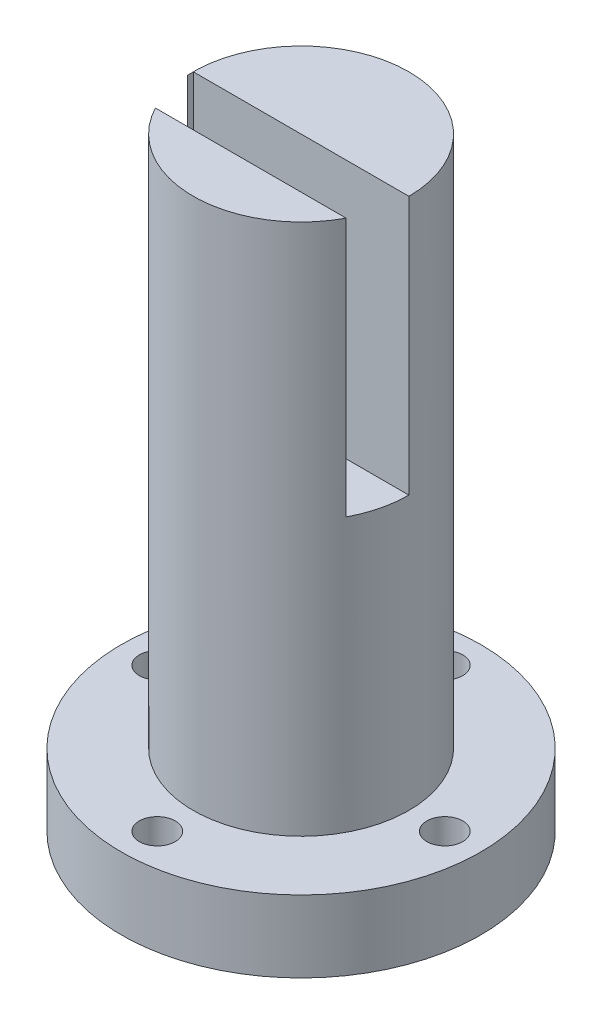
ISO-10303-21;
HEADER;
FILE_DESCRIPTION(('STEP AP214'),'2;1');
FILE_NAME('part.step','',(''),(''),'','','');
FILE_SCHEMA(('AUTOMOTIVE_DESIGN { 1 0 10303 214 1 1 1 1 }'));
ENDSEC;
DATA;
#1=APPLICATION_CONTEXT('core data for automotive mechanical design processes');
#2=APPLICATION_PROTOCOL_DEFINITION('international standard','automotive_design',2000,#1);
#3=PRODUCT_CONTEXT('',#1,'mechanical');
#4=PRODUCT('Part','Part','',(#3));
#5=PRODUCT_RELATED_PRODUCT_CATEGORY('part','',(#4));
#6=PRODUCT_DEFINITION_FORMATION('','',#4);
#7=PRODUCT_DEFINITION_CONTEXT('part definition',#1,'design');
#8=PRODUCT_DEFINITION('design','',#6,#7);
#9=PRODUCT_DEFINITION_SHAPE('','',#8);
#10=(LENGTH_UNIT() NAMED_UNIT(*) SI_UNIT(.MILLI.,.METRE.));
#11=(NAMED_UNIT(*) PLANE_ANGLE_UNIT() SI_UNIT($,.RADIAN.));
#12=(NAMED_UNIT(*) SI_UNIT($,.STERADIAN.) SOLID_ANGLE_UNIT());
#13=UNCERTAINTY_MEASURE_WITH_UNIT(LENGTH_MEASURE(1.E-05),#10,'distance_accuracy_value','');
#14=(GEOMETRIC_REPRESENTATION_CONTEXT(3) GLOBAL_UNCERTAINTY_ASSIGNED_CONTEXT((#13)) GLOBAL_UNIT_ASSIGNED_CONTEXT((#10,
#11,#12)) REPRESENTATION_CONTEXT('',''));
#15=CARTESIAN_POINT('',(0.,0.,0.));
#16=DIRECTION('',(0.,0.,1.));
#17=DIRECTION('',(1.,0.,0.));
#18=AXIS2_PLACEMENT_3D('',#15,#16,#17);
#19=CARTESIAN_POINT('',(0.,44.,0.));
#20=DIRECTION('',(0.,1.,0.));
#21=DIRECTION('',(0.,0.,1.));
#22=AXIS2_PLACEMENT_3D('',#19,#20,#21);
#23=PLANE('',#22);
#24=DIRECTION('',(1.,0.,0.));
#25=VECTOR('',#24,1.);
#26=CARTESIAN_POINT('',(0.,44.,7.));
#27=LINE('',#26,#25);
#28=CARTESIAN_POINT('',(-13.2664991614216,44.,7.00000000000001));
#29=VERTEX_POINT('',#28);
#30=CARTESIAN_POINT('',(13.2664991614216,44.,7.));
#31=VERTEX_POINT('',#30);
#32=EDGE_CURVE('E124',#29,#31,#27,.T.);
#33=ORIENTED_EDGE('',*,*,#32,.F.);
#34=CARTESIAN_POINT('',(0.,44.,0.));
#35=DIRECTION('',(0.,1.,0.));
#36=DIRECTION('',(0.,0.,1.));
#37=AXIS2_PLACEMENT_3D('',#34,#35,#36);
#38=CIRCLE('',#37,15.);
#39=EDGE_CURVE('E120',#29,#31,#38,.T.);
#40=ORIENTED_EDGE('',*,*,#39,.T.);
#41=EDGE_LOOP('',(#33,#40));
#42=FACE_BOUND('',#41,.T.);
#43=ADVANCED_FACE('F37',(#42),#23,.T.);
#44=CARTESIAN_POINT('',(0.,44.,0.));
#45=DIRECTION('',(0.,-1.,0.));
#46=DIRECTION('',(0.,0.,-1.));
#47=AXIS2_PLACEMENT_3D('',#44,#45,#46);
#48=CYLINDRICAL_SURFACE('',#47,15.);
#49=CARTESIAN_POINT('',(15.,44.,0.));
#50=VERTEX_POINT('',#49);
#51=CARTESIAN_POINT('',(-14.9788084874822,44.,0.797054763068494));
#52=VERTEX_POINT('',#51);
#53=EDGE_CURVE('E123',#50,#52,#38,.T.);
#54=ORIENTED_EDGE('',*,*,#53,.F.);
#55=DIRECTION('',(0.,1.,0.));
#56=VECTOR('',#55,1.);
#57=CARTESIAN_POINT('',(15.,8.,0.));
#58=LINE('',#57,#56);
#59=CARTESIAN_POINT('',(15.,8.,0.));
#60=VERTEX_POINT('',#59);
#61=EDGE_CURVE('E92',#60,#50,#58,.T.);
#62=ORIENTED_EDGE('',*,*,#61,.F.);
#63=CARTESIAN_POINT('',(0.,8.,0.));
#64=DIRECTION('',(0.,1.,0.));
#65=DIRECTION('',(0.,0.,1.));
#66=AXIS2_PLACEMENT_3D('',#63,#64,#65);
#67=CIRCLE('',#66,15.);
#68=CARTESIAN_POINT('',(13.2664991614216,8.,7.));
#69=VERTEX_POINT('',#68);
#70=EDGE_CURVE('E11',#69,#60,#67,.T.);
#71=ORIENTED_EDGE('',*,*,#70,.F.);
#72=DIRECTION('',(0.,-1.,0.));
#73=VECTOR('',#72,1.);
#74=CARTESIAN_POINT('',(13.2664991614216,44.,7.));
#75=LINE('',#74,#73);
#76=EDGE_CURVE('E62',#69,#31,#75,.F.);
#77=ORIENTED_EDGE('',*,*,#76,.T.);
#78=ORIENTED_EDGE('',*,*,#39,.F.);
#79=DIRECTION('',(0.,-1.,0.));
#80=VECTOR('',#79,1.);
#81=CARTESIAN_POINT('',(-13.2664991614216,44.,7.00000000000001));
#82=LINE('',#81,#80);
#83=CARTESIAN_POINT('',(-13.2664991614216,8.,7.00000000000001));
#84=VERTEX_POINT('',#83);
#85=EDGE_CURVE('E117',#29,#84,#82,.T.);
#86=ORIENTED_EDGE('',*,*,#85,.T.);
#87=CARTESIAN_POINT('',(-14.9788084874822,8.,0.797054763068494));
#88=VERTEX_POINT('',#87);
#89=EDGE_CURVE('E46',#88,#84,#67,.T.);
#90=ORIENTED_EDGE('',*,*,#89,.F.);
#91=DIRECTION('',(0.,-1.,0.));
#92=VECTOR('',#91,1.);
#93=CARTESIAN_POINT('',(-14.9788084874822,44.,0.797054763068494));
#94=LINE('',#93,#92);
#95=EDGE_CURVE('E99',#88,#52,#94,.F.);
#96=ORIENTED_EDGE('',*,*,#95,.T.);
#97=EDGE_LOOP('',(#54,#62,#71,#77,#78,#86,#90,#96));
#98=FACE_BOUND('',#97,.T.);
#99=CARTESIAN_POINT('',(0.,-30.,0.));
#100=DIRECTION('',(0.,-1.,0.));
#101=DIRECTION('',(0.,0.,-1.));
#102=AXIS2_PLACEMENT_3D('',#99,#100,#101);
#103=CIRCLE('',#102,15.);
#104=CARTESIAN_POINT('',(0.,-30.,-15.));
#105=VERTEX_POINT('',#104);
#106=EDGE_CURVE('E109',#105,#105,#103,.T.);
#107=ORIENTED_EDGE('',*,*,#106,.F.);
#108=EDGE_LOOP('',(#107));
#109=FACE_BOUND('',#108,.T.);
#110=ADVANCED_FACE('F39',(#98,#109),#48,.T.);
#111=DIRECTION('',(-1.,0.,0.));
#112=VECTOR('',#111,1.);
#113=CARTESIAN_POINT('',(15.,44.,0.));
#114=LINE('',#113,#112);
#115=CARTESIAN_POINT('',(-14.9788084874822,44.,0.));
#116=VERTEX_POINT('',#115);
#117=EDGE_CURVE('E54',#50,#116,#114,.T.);
#118=ORIENTED_EDGE('',*,*,#117,.F.);
#119=ORIENTED_EDGE('',*,*,#53,.T.);
#120=DIRECTION('',(0.,0.,1.));
#121=VECTOR('',#120,1.);
#122=CARTESIAN_POINT('',(-14.9788084874822,44.,0.));
#123=LINE('',#122,#121);
#124=EDGE_CURVE('E105',#116,#52,#123,.T.);
#125=ORIENTED_EDGE('',*,*,#124,.F.);
#126=EDGE_LOOP('',(#118,#119,#125));
#127=FACE_BOUND('',#126,.T.);
#128=ADVANCED_FACE('F186',(#127),#23,.T.);
#129=CARTESIAN_POINT('',(0.,8.,0.));
#130=DIRECTION('',(0.,1.,0.));
#131=DIRECTION('',(0.,0.,1.));
#132=AXIS2_PLACEMENT_3D('',#129,#130,#131);
#133=PLANE('',#132);
#134=ORIENTED_EDGE('',*,*,#70,.T.);
#135=DIRECTION('',(-1.,0.,0.));
#136=VECTOR('',#135,1.);
#137=CARTESIAN_POINT('',(15.,8.,0.));
#138=LINE('',#137,#136);
#139=CARTESIAN_POINT('',(-14.9788084874822,8.,0.));
#140=VERTEX_POINT('',#139);
#141=EDGE_CURVE('E88',#60,#140,#138,.T.);
#142=ORIENTED_EDGE('',*,*,#141,.T.);
#143=DIRECTION('',(0.,0.,1.));
#144=VECTOR('',#143,1.);
#145=CARTESIAN_POINT('',(-14.9788084874822,8.,0.));
#146=LINE('',#145,#144);
#147=EDGE_CURVE('E96',#140,#88,#146,.T.);
#148=ORIENTED_EDGE('',*,*,#147,.T.);
#149=ORIENTED_EDGE('',*,*,#89,.T.);
#150=DIRECTION('',(1.,0.,0.));
#151=VECTOR('',#150,1.);
#152=CARTESIAN_POINT('',(15.,8.,7.));
#153=LINE('',#152,#151);
#154=EDGE_CURVE('E93',#84,#69,#153,.T.);
#155=ORIENTED_EDGE('',*,*,#154,.T.);
#156=EDGE_LOOP('',(#134,#142,#148,#149,#155));
#157=FACE_BOUND('',#156,.T.);
#158=ADVANCED_FACE('F103',(#157),#133,.T.);
#159=CARTESIAN_POINT('',(15.,8.,7.));
#160=DIRECTION('',(0.,0.,1.));
#161=DIRECTION('',(1.,0.,0.));
#162=AXIS2_PLACEMENT_3D('',#159,#160,#161);
#163=PLANE('',#162);
#164=ORIENTED_EDGE('',*,*,#32,.T.);
#165=ORIENTED_EDGE('',*,*,#76,.F.);
#166=ORIENTED_EDGE('',*,*,#154,.F.);
#167=ORIENTED_EDGE('',*,*,#85,.F.);
#168=EDGE_LOOP('',(#164,#165,#166,#167));
#169=FACE_BOUND('',#168,.T.);
#170=ADVANCED_FACE('F197',(#169),#163,.F.);
#171=CARTESIAN_POINT('',(-14.9788084874822,8.,0.));
#172=DIRECTION('',(-1.,0.,0.));
#173=DIRECTION('',(0.,0.,1.));
#174=AXIS2_PLACEMENT_3D('',#171,#172,#173);
#175=PLANE('',#174);
#176=ORIENTED_EDGE('',*,*,#147,.F.);
#177=DIRECTION('',(0.,1.,0.));
#178=VECTOR('',#177,1.);
#179=CARTESIAN_POINT('',(-14.9788084874822,8.,0.));
#180=LINE('',#179,#178);
#181=EDGE_CURVE('E84',#140,#116,#180,.T.);
#182=ORIENTED_EDGE('',*,*,#181,.T.);
#183=ORIENTED_EDGE('',*,*,#124,.T.);
#184=ORIENTED_EDGE('',*,*,#95,.F.);
#185=EDGE_LOOP('',(#176,#182,#183,#184));
#186=FACE_BOUND('',#185,.T.);
#187=ADVANCED_FACE('F97',(#186),#175,.F.);
#188=CARTESIAN_POINT('',(15.,8.,0.));
#189=DIRECTION('',(0.,0.,-1.));
#190=DIRECTION('',(-1.,0.,0.));
#191=AXIS2_PLACEMENT_3D('',#188,#189,#190);
#192=PLANE('',#191);
#193=ORIENTED_EDGE('',*,*,#117,.T.);
#194=ORIENTED_EDGE('',*,*,#181,.F.);
#195=ORIENTED_EDGE('',*,*,#141,.F.);
#196=ORIENTED_EDGE('',*,*,#61,.T.);
#197=EDGE_LOOP('',(#193,#194,#195,#196));
#198=FACE_BOUND('',#197,.T.);
#199=ADVANCED_FACE('F86',(#198),#192,.F.);
#200=CARTESIAN_POINT('',(0.,-40.,0.));
#201=DIRECTION('',(0.,1.,0.));
#202=DIRECTION('',(0.,0.,1.));
#203=AXIS2_PLACEMENT_3D('',#200,#201,#202);
#204=CYLINDRICAL_SURFACE('',#203,25.);
#205=CARTESIAN_POINT('',(0.,-40.,0.));
#206=DIRECTION('',(0.,-1.,0.));
#207=DIRECTION('',(0.,0.,-1.));
#208=AXIS2_PLACEMENT_3D('',#205,#206,#207);
#209=CIRCLE('',#208,25.);
#210=CARTESIAN_POINT('',(0.,-40.,-25.));
#211=VERTEX_POINT('',#210);
#212=EDGE_CURVE('E141',#211,#211,#209,.T.);
#213=ORIENTED_EDGE('',*,*,#212,.F.);
#214=EDGE_LOOP('',(#213));
#215=FACE_BOUND('',#214,.T.);
#216=CARTESIAN_POINT('',(0.,-30.,0.));
#217=DIRECTION('',(0.,-1.,0.));
#218=DIRECTION('',(0.,0.,-1.));
#219=AXIS2_PLACEMENT_3D('',#216,#217,#218);
#220=CIRCLE('',#219,25.);
#221=CARTESIAN_POINT('',(0.,-30.,-25.));
#222=VERTEX_POINT('',#221);
#223=EDGE_CURVE('E137',#222,#222,#220,.T.);
#224=ORIENTED_EDGE('',*,*,#223,.T.);
#225=EDGE_LOOP('',(#224));
#226=FACE_BOUND('',#225,.T.);
#227=ADVANCED_FACE('F166',(#215,#226),#204,.T.);
#228=CARTESIAN_POINT('',(0.,-40.,0.));
#229=DIRECTION('',(0.,-1.,0.));
#230=DIRECTION('',(0.,0.,-1.));
#231=AXIS2_PLACEMENT_3D('',#228,#229,#230);
#232=PLANE('',#231);
#233=CARTESIAN_POINT('',(0.,-40.,20.));
#234=DIRECTION('',(0.,-1.,0.));
#235=DIRECTION('',(0.,0.,-1.));
#236=AXIS2_PLACEMENT_3D('',#233,#234,#235);
#237=CIRCLE('',#236,2.5);
#238=CARTESIAN_POINT('',(0.,-40.,17.5));
#239=VERTEX_POINT('',#238);
#240=EDGE_CURVE('E130',#239,#239,#237,.T.);
#241=ORIENTED_EDGE('',*,*,#240,.F.);
#242=EDGE_LOOP('',(#241));
#243=FACE_BOUND('',#242,.T.);
#244=CARTESIAN_POINT('',(20.0000000000006,-40.,5.64760248210638E-13));
#245=DIRECTION('',(0.,-1.,0.));
#246=DIRECTION('',(0.,0.,-1.));
#247=AXIS2_PLACEMENT_3D('',#244,#245,#246);
#248=CIRCLE('',#247,2.50000000000044);
#249=CARTESIAN_POINT('',(20.0000000000006,-40.,-2.49999999999988));
#250=VERTEX_POINT('',#249);
#251=EDGE_CURVE('E153',#250,#250,#248,.T.);
#252=ORIENTED_EDGE('',*,*,#251,.F.);
#253=EDGE_LOOP('',(#252));
#254=FACE_BOUND('',#253,.T.);
#255=CARTESIAN_POINT('',(1.12952049642128E-12,-40.,-20.));
#256=DIRECTION('',(0.,-1.,0.));
#257=DIRECTION('',(0.,0.,-1.));
#258=AXIS2_PLACEMENT_3D('',#255,#256,#257);
#259=CIRCLE('',#258,2.50000000000121);
#260=CARTESIAN_POINT('',(1.12952049642128E-12,-40.,-22.5000000000012));
#261=VERTEX_POINT('',#260);
#262=EDGE_CURVE('E150',#261,#261,#259,.T.);
#263=ORIENTED_EDGE('',*,*,#262,.F.);
#264=EDGE_LOOP('',(#263));
#265=FACE_BOUND('',#264,.T.);
#266=CARTESIAN_POINT('',(-19.9999999999994,-40.,-5.67209541808933E-13));
#267=DIRECTION('',(0.,-1.,0.));
#268=DIRECTION('',(0.,0.,-1.));
#269=AXIS2_PLACEMENT_3D('',#266,#267,#268);
#270=CIRCLE('',#269,2.50000000000091);
#271=CARTESIAN_POINT('',(-19.9999999999994,-40.,-2.50000000000147));
#272=VERTEX_POINT('',#271);
#273=EDGE_CURVE('E147',#272,#272,#270,.T.);
#274=ORIENTED_EDGE('',*,*,#273,.F.);
#275=EDGE_LOOP('',(#274));
#276=FACE_BOUND('',#275,.T.);
#277=ORIENTED_EDGE('',*,*,#212,.T.);
#278=EDGE_LOOP('',(#277));
#279=FACE_BOUND('',#278,.T.);
#280=ADVANCED_FACE('F162',(#243,#254,#265,#276,#279),#232,.T.);
#281=CARTESIAN_POINT('',(0.,-30.,0.));
#282=DIRECTION('',(0.,-1.,0.));
#283=DIRECTION('',(0.,0.,-1.));
#284=AXIS2_PLACEMENT_3D('',#281,#282,#283);
#285=PLANE('',#284);
#286=CARTESIAN_POINT('',(0.,-30.,20.));
#287=DIRECTION('',(0.,-1.,0.));
#288=DIRECTION('',(0.,0.,-1.));
#289=AXIS2_PLACEMENT_3D('',#286,#287,#288);
#290=CIRCLE('',#289,2.5);
#291=CARTESIAN_POINT('',(0.,-30.,17.5));
#292=VERTEX_POINT('',#291);
#293=EDGE_CURVE('E41',#292,#292,#290,.T.);
#294=ORIENTED_EDGE('',*,*,#293,.T.);
#295=EDGE_LOOP('',(#294));
#296=FACE_BOUND('',#295,.T.);
#297=CARTESIAN_POINT('',(20.0000000000006,-30.,5.64760248210638E-13));
#298=DIRECTION('',(0.,-1.,0.));
#299=DIRECTION('',(0.,0.,-1.));
#300=AXIS2_PLACEMENT_3D('',#297,#298,#299);
#301=CIRCLE('',#300,2.50000000000044);
#302=CARTESIAN_POINT('',(20.0000000000006,-30.,-2.49999999999988));
#303=VERTEX_POINT('',#302);
#304=EDGE_CURVE('E132',#303,#303,#301,.T.);
#305=ORIENTED_EDGE('',*,*,#304,.T.);
#306=EDGE_LOOP('',(#305));
#307=FACE_BOUND('',#306,.T.);
#308=CARTESIAN_POINT('',(1.12952049642128E-12,-30.,-20.));
#309=DIRECTION('',(0.,-1.,0.));
#310=DIRECTION('',(0.,0.,-1.));
#311=AXIS2_PLACEMENT_3D('',#308,#309,#310);
#312=CIRCLE('',#311,2.50000000000121);
#313=CARTESIAN_POINT('',(1.12952049642128E-12,-30.,-22.5000000000012));
#314=VERTEX_POINT('',#313);
#315=EDGE_CURVE('E129',#314,#314,#312,.T.);
#316=ORIENTED_EDGE('',*,*,#315,.T.);
#317=EDGE_LOOP('',(#316));
#318=FACE_BOUND('',#317,.T.);
#319=CARTESIAN_POINT('',(-19.9999999999994,-30.,-5.67209541808933E-13));
#320=DIRECTION('',(0.,-1.,0.));
#321=DIRECTION('',(0.,0.,-1.));
#322=AXIS2_PLACEMENT_3D('',#319,#320,#321);
#323=CIRCLE('',#322,2.50000000000091);
#324=CARTESIAN_POINT('',(-19.9999999999994,-30.,-2.50000000000147));
#325=VERTEX_POINT('',#324);
#326=EDGE_CURVE('E126',#325,#325,#323,.T.);
#327=ORIENTED_EDGE('',*,*,#326,.T.);
#328=EDGE_LOOP('',(#327));
#329=FACE_BOUND('',#328,.T.);
#330=ORIENTED_EDGE('',*,*,#106,.T.);
#331=EDGE_LOOP('',(#330));
#332=FACE_BOUND('',#331,.T.);
#333=ORIENTED_EDGE('',*,*,#223,.F.);
#334=EDGE_LOOP('',(#333));
#335=FACE_BOUND('',#334,.T.);
#336=ADVANCED_FACE('F165',(#296,#307,#318,#329,#332,#335),#285,.F.);
#337=CARTESIAN_POINT('',(-19.9999999999994,44.,-5.67209541808933E-13));
#338=DIRECTION('',(0.,-1.,0.));
#339=DIRECTION('',(0.,0.,-1.));
#340=AXIS2_PLACEMENT_3D('',#337,#338,#339);
#341=CYLINDRICAL_SURFACE('',#340,2.50000000000091);
#342=ORIENTED_EDGE('',*,*,#273,.T.);
#343=EDGE_LOOP('',(#342));
#344=FACE_BOUND('',#343,.T.);
#345=ORIENTED_EDGE('',*,*,#326,.F.);
#346=EDGE_LOOP('',(#345));
#347=FACE_BOUND('',#346,.T.);
#348=ADVANCED_FACE('F243',(#344,#347),#341,.F.);
#349=CARTESIAN_POINT('',(1.12952049642128E-12,44.,-20.));
#350=DIRECTION('',(0.,-1.,0.));
#351=DIRECTION('',(0.,0.,-1.));
#352=AXIS2_PLACEMENT_3D('',#349,#350,#351);
#353=CYLINDRICAL_SURFACE('',#352,2.50000000000121);
#354=ORIENTED_EDGE('',*,*,#262,.T.);
#355=EDGE_LOOP('',(#354));
#356=FACE_BOUND('',#355,.T.);
#357=ORIENTED_EDGE('',*,*,#315,.F.);
#358=EDGE_LOOP('',(#357));
#359=FACE_BOUND('',#358,.T.);
#360=ADVANCED_FACE('F252',(#356,#359),#353,.F.);
#361=CARTESIAN_POINT('',(20.0000000000006,44.,5.64760248210638E-13));
#362=DIRECTION('',(0.,-1.,0.));
#363=DIRECTION('',(0.,0.,-1.));
#364=AXIS2_PLACEMENT_3D('',#361,#362,#363);
#365=CYLINDRICAL_SURFACE('',#364,2.50000000000044);
#366=ORIENTED_EDGE('',*,*,#251,.T.);
#367=EDGE_LOOP('',(#366));
#368=FACE_BOUND('',#367,.T.);
#369=ORIENTED_EDGE('',*,*,#304,.F.);
#370=EDGE_LOOP('',(#369));
#371=FACE_BOUND('',#370,.T.);
#372=ADVANCED_FACE('F263',(#368,#371),#365,.F.);
#373=CARTESIAN_POINT('',(0.,44.,20.));
#374=DIRECTION('',(0.,-1.,0.));
#375=DIRECTION('',(0.,0.,-1.));
#376=AXIS2_PLACEMENT_3D('',#373,#374,#375);
#377=CYLINDRICAL_SURFACE('',#376,2.5);
#378=ORIENTED_EDGE('',*,*,#240,.T.);
#379=EDGE_LOOP('',(#378));
#380=FACE_BOUND('',#379,.T.);
#381=ORIENTED_EDGE('',*,*,#293,.F.);
#382=EDGE_LOOP('',(#381));
#383=FACE_BOUND('',#382,.T.);
#384=ADVANCED_FACE('F159',(#380,#383),#377,.F.);
#385=CLOSED_SHELL('',(#43,#110,#128,#158,#170,#187,#199,#227,#280,#336,#348,#360,#372,#384));
#386=MANIFOLD_SOLID_BREP('B2',#385);
#387=ADVANCED_BREP_SHAPE_REPRESENTATION('',(#18,#386),#14);
#388=SHAPE_DEFINITION_REPRESENTATION(#9,#387);
ENDSEC;
END-ISO-10303-21;
